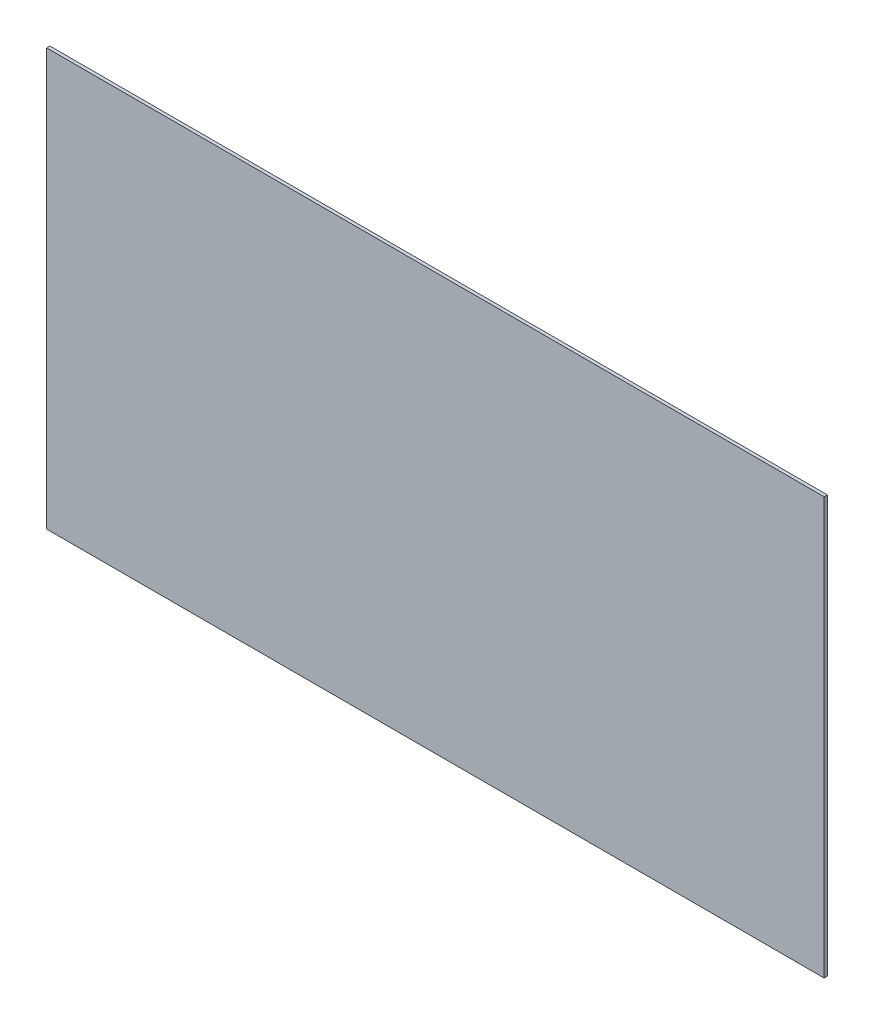
ISO-10303-21;
HEADER;
FILE_DESCRIPTION(('STEP AP214'),'2;1');
FILE_NAME('part.step','',(''),(''),'','','');
FILE_SCHEMA(('AUTOMOTIVE_DESIGN { 1 0 10303 214 1 1 1 1 }'));
ENDSEC;
DATA;
#1=APPLICATION_CONTEXT('core data for automotive mechanical design processes');
#2=APPLICATION_PROTOCOL_DEFINITION('international standard','automotive_design',2000,#1);
#3=PRODUCT_CONTEXT('',#1,'mechanical');
#4=PRODUCT('Part','Part','',(#3));
#5=PRODUCT_RELATED_PRODUCT_CATEGORY('part','',(#4));
#6=PRODUCT_DEFINITION_FORMATION('','',#4);
#7=PRODUCT_DEFINITION_CONTEXT('part definition',#1,'design');
#8=PRODUCT_DEFINITION('design','',#6,#7);
#9=PRODUCT_DEFINITION_SHAPE('','',#8);
#10=(LENGTH_UNIT() NAMED_UNIT(*) SI_UNIT(.MILLI.,.METRE.));
#11=(NAMED_UNIT(*) PLANE_ANGLE_UNIT() SI_UNIT($,.RADIAN.));
#12=(NAMED_UNIT(*) SI_UNIT($,.STERADIAN.) SOLID_ANGLE_UNIT());
#13=UNCERTAINTY_MEASURE_WITH_UNIT(LENGTH_MEASURE(1.E-05),#10,'distance_accuracy_value','');
#14=(GEOMETRIC_REPRESENTATION_CONTEXT(3) GLOBAL_UNCERTAINTY_ASSIGNED_CONTEXT((#13)) GLOBAL_UNIT_ASSIGNED_CONTEXT((#10,
#11,#12)) REPRESENTATION_CONTEXT('',''));
#15=CARTESIAN_POINT('',(0.,0.,0.));
#16=DIRECTION('',(0.,0.,1.));
#17=DIRECTION('',(1.,0.,0.));
#18=AXIS2_PLACEMENT_3D('',#15,#16,#17);
#19=CARTESIAN_POINT('',(0.,0.,2.));
#20=DIRECTION('',(1.,0.,0.));
#21=DIRECTION('',(0.,0.,-1.));
#22=AXIS2_PLACEMENT_3D('',#19,#20,#21);
#23=PLANE('',#22);
#24=DIRECTION('',(0.,-1.,0.));
#25=VECTOR('',#24,1.);
#26=CARTESIAN_POINT('',(0.,0.,0.));
#27=LINE('',#26,#25);
#28=CARTESIAN_POINT('',(0.,260.,0.));
#29=VERTEX_POINT('',#28);
#30=CARTESIAN_POINT('',(0.,0.,0.));
#31=VERTEX_POINT('',#30);
#32=EDGE_CURVE('E96',#29,#31,#27,.T.);
#33=ORIENTED_EDGE('',*,*,#32,.T.);
#34=DIRECTION('',(0.,0.,-1.));
#35=VECTOR('',#34,1.);
#36=CARTESIAN_POINT('',(0.,0.,2.));
#37=LINE('',#36,#35);
#38=CARTESIAN_POINT('',(0.,0.,2.));
#39=VERTEX_POINT('',#38);
#40=EDGE_CURVE('E11',#39,#31,#37,.T.);
#41=ORIENTED_EDGE('',*,*,#40,.F.);
#42=DIRECTION('',(0.,-1.,0.));
#43=VECTOR('',#42,1.);
#44=CARTESIAN_POINT('',(0.,0.,2.));
#45=LINE('',#44,#43);
#46=CARTESIAN_POINT('',(0.,260.,2.));
#47=VERTEX_POINT('',#46);
#48=EDGE_CURVE('E84',#47,#39,#45,.T.);
#49=ORIENTED_EDGE('',*,*,#48,.F.);
#50=DIRECTION('',(0.,0.,-1.));
#51=VECTOR('',#50,1.);
#52=CARTESIAN_POINT('',(0.,260.,2.));
#53=LINE('',#52,#51);
#54=EDGE_CURVE('E92',#47,#29,#53,.T.);
#55=ORIENTED_EDGE('',*,*,#54,.T.);
#56=EDGE_LOOP('',(#33,#41,#49,#55));
#57=FACE_BOUND('',#56,.T.);
#58=ADVANCED_FACE('F33',(#57),#23,.F.);
#59=CARTESIAN_POINT('',(0.,0.,2.));
#60=DIRECTION('',(0.,1.,0.));
#61=DIRECTION('',(0.,0.,1.));
#62=AXIS2_PLACEMENT_3D('',#59,#60,#61);
#63=PLANE('',#62);
#64=DIRECTION('',(1.,0.,0.));
#65=VECTOR('',#64,1.);
#66=CARTESIAN_POINT('',(0.,0.,0.));
#67=LINE('',#66,#65);
#68=CARTESIAN_POINT('',(485.,0.,0.));
#69=VERTEX_POINT('',#68);
#70=EDGE_CURVE('E88',#31,#69,#67,.T.);
#71=ORIENTED_EDGE('',*,*,#70,.T.);
#72=DIRECTION('',(0.,0.,-1.));
#73=VECTOR('',#72,1.);
#74=CARTESIAN_POINT('',(485.,0.,2.));
#75=LINE('',#74,#73);
#76=CARTESIAN_POINT('',(485.,0.,2.));
#77=VERTEX_POINT('',#76);
#78=EDGE_CURVE('E41',#77,#69,#75,.T.);
#79=ORIENTED_EDGE('',*,*,#78,.F.);
#80=DIRECTION('',(1.,0.,0.));
#81=VECTOR('',#80,1.);
#82=CARTESIAN_POINT('',(0.,0.,2.));
#83=LINE('',#82,#81);
#84=EDGE_CURVE('E79',#39,#77,#83,.T.);
#85=ORIENTED_EDGE('',*,*,#84,.F.);
#86=ORIENTED_EDGE('',*,*,#40,.T.);
#87=EDGE_LOOP('',(#71,#79,#85,#86));
#88=FACE_BOUND('',#87,.T.);
#89=ADVANCED_FACE('F87',(#88),#63,.F.);
#90=CARTESIAN_POINT('',(485.,0.,2.));
#91=DIRECTION('',(-1.,0.,0.));
#92=DIRECTION('',(0.,0.,1.));
#93=AXIS2_PLACEMENT_3D('',#90,#91,#92);
#94=PLANE('',#93);
#95=DIRECTION('',(0.,1.,0.));
#96=VECTOR('',#95,1.);
#97=CARTESIAN_POINT('',(485.,0.,0.));
#98=LINE('',#97,#96);
#99=CARTESIAN_POINT('',(485.,260.,0.));
#100=VERTEX_POINT('',#99);
#101=EDGE_CURVE('E66',#69,#100,#98,.T.);
#102=ORIENTED_EDGE('',*,*,#101,.T.);
#103=DIRECTION('',(0.,0.,-1.));
#104=VECTOR('',#103,1.);
#105=CARTESIAN_POINT('',(485.,260.,2.));
#106=LINE('',#105,#104);
#107=CARTESIAN_POINT('',(485.,260.,2.));
#108=VERTEX_POINT('',#107);
#109=EDGE_CURVE('E89',#108,#100,#106,.T.);
#110=ORIENTED_EDGE('',*,*,#109,.F.);
#111=DIRECTION('',(0.,1.,0.));
#112=VECTOR('',#111,1.);
#113=CARTESIAN_POINT('',(485.,0.,2.));
#114=LINE('',#113,#112);
#115=EDGE_CURVE('E82',#77,#108,#114,.T.);
#116=ORIENTED_EDGE('',*,*,#115,.F.);
#117=ORIENTED_EDGE('',*,*,#78,.T.);
#118=EDGE_LOOP('',(#102,#110,#116,#117));
#119=FACE_BOUND('',#118,.T.);
#120=ADVANCED_FACE('F90',(#119),#94,.F.);
#121=CARTESIAN_POINT('',(0.,260.,2.));
#122=DIRECTION('',(0.,-1.,0.));
#123=DIRECTION('',(0.,0.,-1.));
#124=AXIS2_PLACEMENT_3D('',#121,#122,#123);
#125=PLANE('',#124);
#126=DIRECTION('',(-1.,0.,0.));
#127=VECTOR('',#126,1.);
#128=CARTESIAN_POINT('',(0.,260.,0.));
#129=LINE('',#128,#127);
#130=EDGE_CURVE('E72',#100,#29,#129,.T.);
#131=ORIENTED_EDGE('',*,*,#130,.T.);
#132=ORIENTED_EDGE('',*,*,#54,.F.);
#133=DIRECTION('',(-1.,0.,0.));
#134=VECTOR('',#133,1.);
#135=CARTESIAN_POINT('',(0.,260.,2.));
#136=LINE('',#135,#134);
#137=EDGE_CURVE('E49',#108,#47,#136,.T.);
#138=ORIENTED_EDGE('',*,*,#137,.F.);
#139=ORIENTED_EDGE('',*,*,#109,.T.);
#140=EDGE_LOOP('',(#131,#132,#138,#139));
#141=FACE_BOUND('',#140,.T.);
#142=ADVANCED_FACE('F103',(#141),#125,.F.);
#143=CARTESIAN_POINT('',(0.,0.,2.));
#144=DIRECTION('',(0.,0.,-1.));
#145=DIRECTION('',(-1.,0.,0.));
#146=AXIS2_PLACEMENT_3D('',#143,#144,#145);
#147=PLANE('',#146);
#148=ORIENTED_EDGE('',*,*,#48,.T.);
#149=ORIENTED_EDGE('',*,*,#84,.T.);
#150=ORIENTED_EDGE('',*,*,#115,.T.);
#151=ORIENTED_EDGE('',*,*,#137,.T.);
#152=EDGE_LOOP('',(#148,#149,#150,#151));
#153=FACE_BOUND('',#152,.T.);
#154=ADVANCED_FACE('F80',(#153),#147,.F.);
#155=CARTESIAN_POINT('',(0.,0.,0.));
#156=DIRECTION('',(0.,0.,-1.));
#157=DIRECTION('',(-1.,0.,0.));
#158=AXIS2_PLACEMENT_3D('',#155,#156,#157);
#159=PLANE('',#158);
#160=ORIENTED_EDGE('',*,*,#32,.F.);
#161=ORIENTED_EDGE('',*,*,#130,.F.);
#162=ORIENTED_EDGE('',*,*,#101,.F.);
#163=ORIENTED_EDGE('',*,*,#70,.F.);
#164=EDGE_LOOP('',(#160,#161,#162,#163));
#165=FACE_BOUND('',#164,.T.);
#166=ADVANCED_FACE('F106',(#165),#159,.T.);
#167=CLOSED_SHELL('',(#58,#89,#120,#142,#154,#166));
#168=MANIFOLD_SOLID_BREP('B2',#167);
#169=ADVANCED_BREP_SHAPE_REPRESENTATION('',(#18,#168),#14);
#170=SHAPE_DEFINITION_REPRESENTATION(#9,#169);
ENDSEC;
END-ISO-10303-21;
